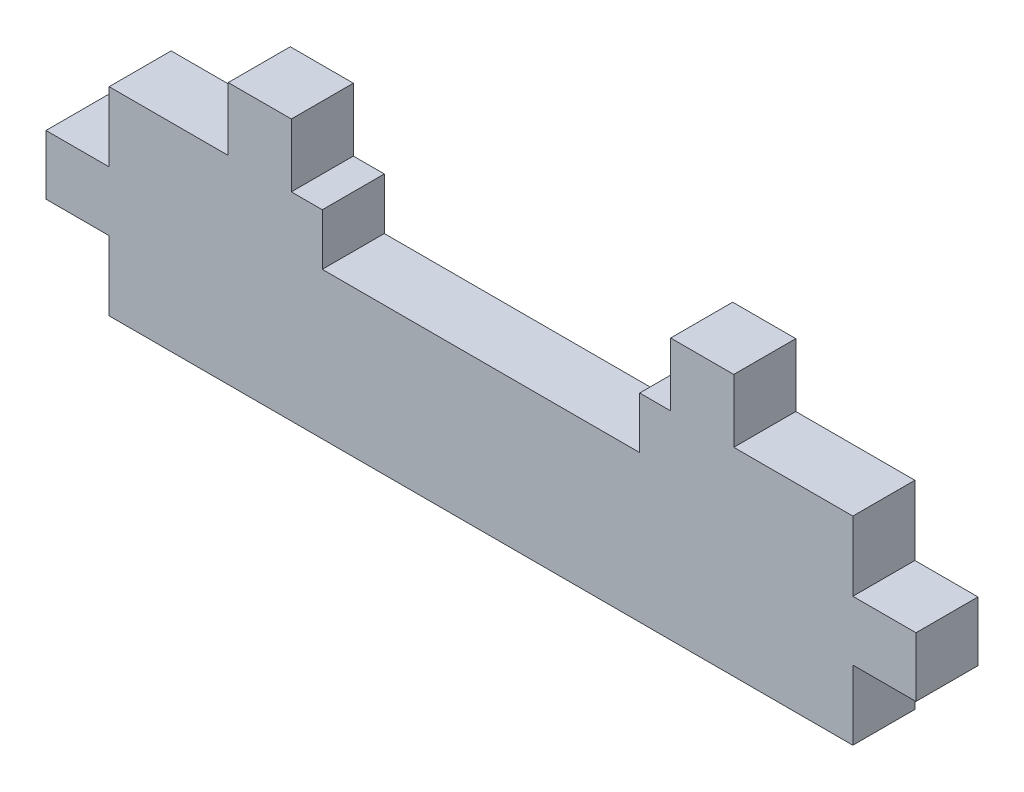
ISO-10303-21;
HEADER;
FILE_DESCRIPTION(('STEP AP214'),'2;1');
FILE_NAME('part.step','',(''),(''),'','','');
FILE_SCHEMA(('AUTOMOTIVE_DESIGN { 1 0 10303 214 1 1 1 1 }'));
ENDSEC;
DATA;
#1=APPLICATION_CONTEXT('core data for automotive mechanical design processes');
#2=APPLICATION_PROTOCOL_DEFINITION('international standard','automotive_design',2000,#1);
#3=PRODUCT_CONTEXT('',#1,'mechanical');
#4=PRODUCT('Part','Part','',(#3));
#5=PRODUCT_RELATED_PRODUCT_CATEGORY('part','',(#4));
#6=PRODUCT_DEFINITION_FORMATION('','',#4);
#7=PRODUCT_DEFINITION_CONTEXT('part definition',#1,'design');
#8=PRODUCT_DEFINITION('design','',#6,#7);
#9=PRODUCT_DEFINITION_SHAPE('','',#8);
#10=(LENGTH_UNIT() NAMED_UNIT(*) SI_UNIT(.MILLI.,.METRE.));
#11=(NAMED_UNIT(*) PLANE_ANGLE_UNIT() SI_UNIT($,.RADIAN.));
#12=(NAMED_UNIT(*) SI_UNIT($,.STERADIAN.) SOLID_ANGLE_UNIT());
#13=UNCERTAINTY_MEASURE_WITH_UNIT(LENGTH_MEASURE(1.E-05),#10,'distance_accuracy_value','');
#14=(GEOMETRIC_REPRESENTATION_CONTEXT(3) GLOBAL_UNCERTAINTY_ASSIGNED_CONTEXT((#13)) GLOBAL_UNIT_ASSIGNED_CONTEXT((#10,
#11,#12)) REPRESENTATION_CONTEXT('',''));
#15=CARTESIAN_POINT('',(0.,0.,0.));
#16=DIRECTION('',(0.,0.,1.));
#17=DIRECTION('',(1.,0.,0.));
#18=AXIS2_PLACEMENT_3D('',#15,#16,#17);
#19=CARTESIAN_POINT('',(0.,-6.59,3.125));
#20=DIRECTION('',(0.,1.,0.));
#21=DIRECTION('',(0.,0.,1.));
#22=AXIS2_PLACEMENT_3D('',#19,#20,#21);
#23=PLANE('',#22);
#24=DIRECTION('',(1.,0.,0.));
#25=VECTOR('',#24,1.);
#26=CARTESIAN_POINT('',(0.,-6.59,0.));
#27=LINE('',#26,#25);
#28=CARTESIAN_POINT('',(-18.735,-6.59,0.));
#29=VERTEX_POINT('',#28);
#30=CARTESIAN_POINT('',(18.735,-6.59,0.));
#31=VERTEX_POINT('',#30);
#32=EDGE_CURVE('E174',#29,#31,#27,.T.);
#33=ORIENTED_EDGE('',*,*,#32,.T.);
#34=DIRECTION('',(0.,0.,-1.));
#35=VECTOR('',#34,1.);
#36=CARTESIAN_POINT('',(18.735,-6.59,3.125));
#37=LINE('',#36,#35);
#38=CARTESIAN_POINT('',(18.735,-6.59,3.125));
#39=VERTEX_POINT('',#38);
#40=EDGE_CURVE('E11',#39,#31,#37,.T.);
#41=ORIENTED_EDGE('',*,*,#40,.F.);
#42=DIRECTION('',(1.,0.,0.));
#43=VECTOR('',#42,1.);
#44=CARTESIAN_POINT('',(0.,-6.59,3.125));
#45=LINE('',#44,#43);
#46=CARTESIAN_POINT('',(-18.735,-6.59,3.125));
#47=VERTEX_POINT('',#46);
#48=EDGE_CURVE('E114',#47,#39,#45,.T.);
#49=ORIENTED_EDGE('',*,*,#48,.F.);
#50=DIRECTION('',(0.,0.,-1.));
#51=VECTOR('',#50,1.);
#52=CARTESIAN_POINT('',(-18.735,-6.59,3.125));
#53=LINE('',#52,#51);
#54=EDGE_CURVE('E385',#47,#29,#53,.T.);
#55=ORIENTED_EDGE('',*,*,#54,.T.);
#56=EDGE_LOOP('',(#33,#41,#49,#55));
#57=FACE_BOUND('',#56,.T.);
#58=ADVANCED_FACE('F39',(#57),#23,.F.);
#59=CARTESIAN_POINT('',(18.735,-6.59,3.125));
#60=DIRECTION('',(-1.,0.,0.));
#61=DIRECTION('',(0.,-1.,0.));
#62=AXIS2_PLACEMENT_3D('',#59,#60,#61);
#63=PLANE('',#62);
#64=DIRECTION('',(0.,1.,0.));
#65=VECTOR('',#64,1.);
#66=CARTESIAN_POINT('',(18.735,-6.59,0.));
#67=LINE('',#66,#65);
#68=CARTESIAN_POINT('',(18.735,-3.09,0.));
#69=VERTEX_POINT('',#68);
#70=EDGE_CURVE('E177',#31,#69,#67,.T.);
#71=ORIENTED_EDGE('',*,*,#70,.T.);
#72=DIRECTION('',(0.,0.,-1.));
#73=VECTOR('',#72,1.);
#74=CARTESIAN_POINT('',(18.735,-3.09,3.125));
#75=LINE('',#74,#73);
#76=CARTESIAN_POINT('',(18.735,-3.09,3.125));
#77=VERTEX_POINT('',#76);
#78=EDGE_CURVE('E48',#77,#69,#75,.T.);
#79=ORIENTED_EDGE('',*,*,#78,.F.);
#80=DIRECTION('',(0.,1.,0.));
#81=VECTOR('',#80,1.);
#82=CARTESIAN_POINT('',(18.735,-6.59,3.125));
#83=LINE('',#82,#81);
#84=EDGE_CURVE('E435',#39,#77,#83,.T.);
#85=ORIENTED_EDGE('',*,*,#84,.F.);
#86=ORIENTED_EDGE('',*,*,#40,.T.);
#87=EDGE_LOOP('',(#71,#79,#85,#86));
#88=FACE_BOUND('',#87,.T.);
#89=ADVANCED_FACE('F438',(#88),#63,.F.);
#90=CARTESIAN_POINT('',(18.735,-3.09,3.125));
#91=DIRECTION('',(0.,1.,0.));
#92=DIRECTION('',(-1.,0.,0.));
#93=AXIS2_PLACEMENT_3D('',#90,#91,#92);
#94=PLANE('',#93);
#95=DIRECTION('',(1.,0.,0.));
#96=VECTOR('',#95,1.);
#97=CARTESIAN_POINT('',(18.735,-3.09,0.));
#98=LINE('',#97,#96);
#99=CARTESIAN_POINT('',(21.915,-3.09,0.));
#100=VERTEX_POINT('',#99);
#101=EDGE_CURVE('E181',#69,#100,#98,.T.);
#102=ORIENTED_EDGE('',*,*,#101,.T.);
#103=DIRECTION('',(0.,0.,-1.));
#104=VECTOR('',#103,1.);
#105=CARTESIAN_POINT('',(21.915,-3.09,3.125));
#106=LINE('',#105,#104);
#107=CARTESIAN_POINT('',(21.915,-3.09,3.125));
#108=VERTEX_POINT('',#107);
#109=EDGE_CURVE('E238',#108,#100,#106,.T.);
#110=ORIENTED_EDGE('',*,*,#109,.F.);
#111=DIRECTION('',(1.,0.,0.));
#112=VECTOR('',#111,1.);
#113=CARTESIAN_POINT('',(18.735,-3.09,3.125));
#114=LINE('',#113,#112);
#115=EDGE_CURVE('E249',#77,#108,#114,.T.);
#116=ORIENTED_EDGE('',*,*,#115,.F.);
#117=ORIENTED_EDGE('',*,*,#78,.T.);
#118=EDGE_LOOP('',(#102,#110,#116,#117));
#119=FACE_BOUND('',#118,.T.);
#120=ADVANCED_FACE('F247',(#119),#94,.F.);
#121=CARTESIAN_POINT('',(21.915,-3.09,3.125));
#122=DIRECTION('',(-1.,0.,0.));
#123=DIRECTION('',(0.,-1.,0.));
#124=AXIS2_PLACEMENT_3D('',#121,#122,#123);
#125=PLANE('',#124);
#126=DIRECTION('',(0.,1.,0.));
#127=VECTOR('',#126,1.);
#128=CARTESIAN_POINT('',(21.915,-3.09,0.));
#129=LINE('',#128,#127);
#130=CARTESIAN_POINT('',(21.915,-0.0899999999999968,0.));
#131=VERTEX_POINT('',#130);
#132=EDGE_CURVE('E184',#100,#131,#129,.T.);
#133=ORIENTED_EDGE('',*,*,#132,.T.);
#134=DIRECTION('',(0.,0.,-1.));
#135=VECTOR('',#134,1.);
#136=CARTESIAN_POINT('',(21.915,-0.0899999999999968,3.125));
#137=LINE('',#136,#135);
#138=CARTESIAN_POINT('',(21.915,-0.0899999999999968,3.125));
#139=VERTEX_POINT('',#138);
#140=EDGE_CURVE('E234',#139,#131,#137,.T.);
#141=ORIENTED_EDGE('',*,*,#140,.F.);
#142=DIRECTION('',(0.,1.,0.));
#143=VECTOR('',#142,1.);
#144=CARTESIAN_POINT('',(21.915,-3.09,3.125));
#145=LINE('',#144,#143);
#146=EDGE_CURVE('E270',#108,#139,#145,.T.);
#147=ORIENTED_EDGE('',*,*,#146,.F.);
#148=ORIENTED_EDGE('',*,*,#109,.T.);
#149=EDGE_LOOP('',(#133,#141,#147,#148));
#150=FACE_BOUND('',#149,.T.);
#151=ADVANCED_FACE('F260',(#150),#125,.F.);
#152=CARTESIAN_POINT('',(21.915,-0.0899999999999968,3.125));
#153=DIRECTION('',(0.,-1.,0.));
#154=DIRECTION('',(1.,0.,0.));
#155=AXIS2_PLACEMENT_3D('',#152,#153,#154);
#156=PLANE('',#155);
#157=DIRECTION('',(-1.,0.,0.));
#158=VECTOR('',#157,1.);
#159=CARTESIAN_POINT('',(21.915,-0.0899999999999968,0.));
#160=LINE('',#159,#158);
#161=CARTESIAN_POINT('',(18.735,-0.0899999999999971,0.));
#162=VERTEX_POINT('',#161);
#163=EDGE_CURVE('E187',#131,#162,#160,.T.);
#164=ORIENTED_EDGE('',*,*,#163,.T.);
#165=DIRECTION('',(0.,0.,-1.));
#166=VECTOR('',#165,1.);
#167=CARTESIAN_POINT('',(18.735,-0.0899999999999971,3.125));
#168=LINE('',#167,#166);
#169=CARTESIAN_POINT('',(18.735,-0.0899999999999971,3.125));
#170=VERTEX_POINT('',#169);
#171=EDGE_CURVE('E230',#170,#162,#168,.T.);
#172=ORIENTED_EDGE('',*,*,#171,.F.);
#173=DIRECTION('',(-1.,0.,0.));
#174=VECTOR('',#173,1.);
#175=CARTESIAN_POINT('',(21.915,-0.0899999999999968,3.125));
#176=LINE('',#175,#174);
#177=EDGE_CURVE('E266',#139,#170,#176,.T.);
#178=ORIENTED_EDGE('',*,*,#177,.F.);
#179=ORIENTED_EDGE('',*,*,#140,.T.);
#180=EDGE_LOOP('',(#164,#172,#178,#179));
#181=FACE_BOUND('',#180,.T.);
#182=ADVANCED_FACE('F264',(#181),#156,.F.);
#183=CARTESIAN_POINT('',(18.735,-0.0899999999999971,3.125));
#184=DIRECTION('',(-1.,0.,0.));
#185=DIRECTION('',(0.,0.,1.));
#186=AXIS2_PLACEMENT_3D('',#183,#184,#185);
#187=PLANE('',#186);
#188=DIRECTION('',(0.,1.,0.));
#189=VECTOR('',#188,1.);
#190=CARTESIAN_POINT('',(18.735,-0.0899999999999971,0.));
#191=LINE('',#190,#189);
#192=CARTESIAN_POINT('',(18.735,3.41,0.));
#193=VERTEX_POINT('',#192);
#194=EDGE_CURVE('E190',#162,#193,#191,.T.);
#195=ORIENTED_EDGE('',*,*,#194,.T.);
#196=DIRECTION('',(0.,0.,-1.));
#197=VECTOR('',#196,1.);
#198=CARTESIAN_POINT('',(18.735,3.41,3.125));
#199=LINE('',#198,#197);
#200=CARTESIAN_POINT('',(18.735,3.41,3.125));
#201=VERTEX_POINT('',#200);
#202=EDGE_CURVE('E226',#201,#193,#199,.T.);
#203=ORIENTED_EDGE('',*,*,#202,.F.);
#204=DIRECTION('',(0.,1.,0.));
#205=VECTOR('',#204,1.);
#206=CARTESIAN_POINT('',(18.735,-0.0899999999999971,3.125));
#207=LINE('',#206,#205);
#208=EDGE_CURVE('E269',#170,#201,#207,.T.);
#209=ORIENTED_EDGE('',*,*,#208,.F.);
#210=ORIENTED_EDGE('',*,*,#171,.T.);
#211=EDGE_LOOP('',(#195,#203,#209,#210));
#212=FACE_BOUND('',#211,.T.);
#213=ADVANCED_FACE('F545',(#212),#187,.F.);
#214=CARTESIAN_POINT('',(18.735,3.41,3.125));
#215=DIRECTION('',(0.,-1.,0.));
#216=DIRECTION('',(1.,0.,0.));
#217=AXIS2_PLACEMENT_3D('',#214,#215,#216);
#218=PLANE('',#217);
#219=DIRECTION('',(-1.,0.,0.));
#220=VECTOR('',#219,1.);
#221=CARTESIAN_POINT('',(18.735,3.41,0.));
#222=LINE('',#221,#220);
#223=CARTESIAN_POINT('',(12.735,3.41,0.));
#224=VERTEX_POINT('',#223);
#225=EDGE_CURVE('E193',#193,#224,#222,.T.);
#226=ORIENTED_EDGE('',*,*,#225,.T.);
#227=DIRECTION('',(0.,0.,-1.));
#228=VECTOR('',#227,1.);
#229=CARTESIAN_POINT('',(12.735,3.41,3.125));
#230=LINE('',#229,#228);
#231=CARTESIAN_POINT('',(12.735,3.41,3.125));
#232=VERTEX_POINT('',#231);
#233=EDGE_CURVE('E222',#232,#224,#230,.T.);
#234=ORIENTED_EDGE('',*,*,#233,.F.);
#235=DIRECTION('',(-1.,0.,0.));
#236=VECTOR('',#235,1.);
#237=CARTESIAN_POINT('',(18.735,3.41,3.125));
#238=LINE('',#237,#236);
#239=EDGE_CURVE('E274',#201,#232,#238,.T.);
#240=ORIENTED_EDGE('',*,*,#239,.F.);
#241=ORIENTED_EDGE('',*,*,#202,.T.);
#242=EDGE_LOOP('',(#226,#234,#240,#241));
#243=FACE_BOUND('',#242,.T.);
#244=ADVANCED_FACE('F548',(#243),#218,.F.);
#245=CARTESIAN_POINT('',(12.735,3.41,3.125));
#246=DIRECTION('',(-1.,0.,0.));
#247=DIRECTION('',(0.,0.,1.));
#248=AXIS2_PLACEMENT_3D('',#245,#246,#247);
#249=PLANE('',#248);
#250=DIRECTION('',(0.,1.,0.));
#251=VECTOR('',#250,1.);
#252=CARTESIAN_POINT('',(12.735,3.41,0.));
#253=LINE('',#252,#251);
#254=CARTESIAN_POINT('',(12.735,6.59,0.));
#255=VERTEX_POINT('',#254);
#256=EDGE_CURVE('E196',#224,#255,#253,.T.);
#257=ORIENTED_EDGE('',*,*,#256,.T.);
#258=DIRECTION('',(0.,0.,-1.));
#259=VECTOR('',#258,1.);
#260=CARTESIAN_POINT('',(12.735,6.59,3.125));
#261=LINE('',#260,#259);
#262=CARTESIAN_POINT('',(12.735,6.59,3.125));
#263=VERTEX_POINT('',#262);
#264=EDGE_CURVE('E218',#263,#255,#261,.T.);
#265=ORIENTED_EDGE('',*,*,#264,.F.);
#266=DIRECTION('',(0.,1.,0.));
#267=VECTOR('',#266,1.);
#268=CARTESIAN_POINT('',(12.735,3.41,3.125));
#269=LINE('',#268,#267);
#270=EDGE_CURVE('E281',#232,#263,#269,.T.);
#271=ORIENTED_EDGE('',*,*,#270,.F.);
#272=ORIENTED_EDGE('',*,*,#233,.T.);
#273=EDGE_LOOP('',(#257,#265,#271,#272));
#274=FACE_BOUND('',#273,.T.);
#275=ADVANCED_FACE('F289',(#274),#249,.F.);
#276=CARTESIAN_POINT('',(12.735,6.59,3.125));
#277=DIRECTION('',(0.,-1.,0.));
#278=DIRECTION('',(0.,0.,-1.));
#279=AXIS2_PLACEMENT_3D('',#276,#277,#278);
#280=PLANE('',#279);
#281=DIRECTION('',(-1.,0.,0.));
#282=VECTOR('',#281,1.);
#283=CARTESIAN_POINT('',(12.735,6.59,0.));
#284=LINE('',#283,#282);
#285=CARTESIAN_POINT('',(9.55499999999999,6.59,0.));
#286=VERTEX_POINT('',#285);
#287=EDGE_CURVE('E199',#255,#286,#284,.T.);
#288=ORIENTED_EDGE('',*,*,#287,.T.);
#289=DIRECTION('',(0.,0.,-1.));
#290=VECTOR('',#289,1.);
#291=CARTESIAN_POINT('',(9.55499999999999,6.59,3.125));
#292=LINE('',#291,#290);
#293=CARTESIAN_POINT('',(9.55499999999999,6.59,3.125));
#294=VERTEX_POINT('',#293);
#295=EDGE_CURVE('E160',#294,#286,#292,.T.);
#296=ORIENTED_EDGE('',*,*,#295,.F.);
#297=DIRECTION('',(-1.,0.,0.));
#298=VECTOR('',#297,1.);
#299=CARTESIAN_POINT('',(12.735,6.59,3.125));
#300=LINE('',#299,#298);
#301=EDGE_CURVE('E149',#263,#294,#300,.T.);
#302=ORIENTED_EDGE('',*,*,#301,.F.);
#303=ORIENTED_EDGE('',*,*,#264,.T.);
#304=EDGE_LOOP('',(#288,#296,#302,#303));
#305=FACE_BOUND('',#304,.T.);
#306=ADVANCED_FACE('F293',(#305),#280,.F.);
#307=CARTESIAN_POINT('',(9.55499999999999,6.59,3.125));
#308=DIRECTION('',(1.,0.,0.));
#309=DIRECTION('',(0.,1.,0.));
#310=AXIS2_PLACEMENT_3D('',#307,#308,#309);
#311=PLANE('',#310);
#312=DIRECTION('',(0.,-1.,0.));
#313=VECTOR('',#312,1.);
#314=CARTESIAN_POINT('',(9.55499999999999,6.59,0.));
#315=LINE('',#314,#313);
#316=CARTESIAN_POINT('',(9.555,3.41,0.));
#317=VERTEX_POINT('',#316);
#318=EDGE_CURVE('E158',#286,#317,#315,.T.);
#319=ORIENTED_EDGE('',*,*,#318,.T.);
#320=DIRECTION('',(0.,0.,-1.));
#321=VECTOR('',#320,1.);
#322=CARTESIAN_POINT('',(9.555,3.41,3.125));
#323=LINE('',#322,#321);
#324=CARTESIAN_POINT('',(9.555,3.41,3.125));
#325=VERTEX_POINT('',#324);
#326=EDGE_CURVE('E155',#325,#317,#323,.T.);
#327=ORIENTED_EDGE('',*,*,#326,.F.);
#328=DIRECTION('',(0.,-1.,0.));
#329=VECTOR('',#328,1.);
#330=CARTESIAN_POINT('',(9.55499999999999,6.59,3.125));
#331=LINE('',#330,#329);
#332=EDGE_CURVE('E143',#294,#325,#331,.T.);
#333=ORIENTED_EDGE('',*,*,#332,.F.);
#334=ORIENTED_EDGE('',*,*,#295,.T.);
#335=EDGE_LOOP('',(#319,#327,#333,#334));
#336=FACE_BOUND('',#335,.T.);
#337=ADVANCED_FACE('F156',(#336),#311,.F.);
#338=CARTESIAN_POINT('',(9.555,3.41,3.125));
#339=DIRECTION('',(0.,-1.,0.));
#340=DIRECTION('',(1.,0.,0.));
#341=AXIS2_PLACEMENT_3D('',#338,#339,#340);
#342=PLANE('',#341);
#343=DIRECTION('',(-1.,0.,0.));
#344=VECTOR('',#343,1.);
#345=CARTESIAN_POINT('',(9.555,3.41,0.));
#346=LINE('',#345,#344);
#347=CARTESIAN_POINT('',(7.99499999999999,3.41,0.));
#348=VERTEX_POINT('',#347);
#349=EDGE_CURVE('E98',#317,#348,#346,.T.);
#350=ORIENTED_EDGE('',*,*,#349,.T.);
#351=DIRECTION('',(0.,0.,-1.));
#352=VECTOR('',#351,1.);
#353=CARTESIAN_POINT('',(7.99499999999999,3.41,3.125));
#354=LINE('',#353,#352);
#355=CARTESIAN_POINT('',(7.99499999999999,3.41,3.125));
#356=VERTEX_POINT('',#355);
#357=EDGE_CURVE('E161',#356,#348,#354,.T.);
#358=ORIENTED_EDGE('',*,*,#357,.F.);
#359=DIRECTION('',(-1.,0.,0.));
#360=VECTOR('',#359,1.);
#361=CARTESIAN_POINT('',(9.555,3.41,3.125));
#362=LINE('',#361,#360);
#363=EDGE_CURVE('E147',#325,#356,#362,.T.);
#364=ORIENTED_EDGE('',*,*,#363,.F.);
#365=ORIENTED_EDGE('',*,*,#326,.T.);
#366=EDGE_LOOP('',(#350,#358,#364,#365));
#367=FACE_BOUND('',#366,.T.);
#368=ADVANCED_FACE('F163',(#367),#342,.F.);
#369=CARTESIAN_POINT('',(7.99499999999999,3.41,3.125));
#370=DIRECTION('',(1.,0.,0.));
#371=DIRECTION('',(0.,1.,0.));
#372=AXIS2_PLACEMENT_3D('',#369,#370,#371);
#373=PLANE('',#372);
#374=DIRECTION('',(0.,-1.,0.));
#375=VECTOR('',#374,1.);
#376=CARTESIAN_POINT('',(7.99499999999999,3.41,0.));
#377=LINE('',#376,#375);
#378=CARTESIAN_POINT('',(7.995,0.81,0.));
#379=VERTEX_POINT('',#378);
#380=EDGE_CURVE('E206',#348,#379,#377,.T.);
#381=ORIENTED_EDGE('',*,*,#380,.T.);
#382=DIRECTION('',(0.,0.,-1.));
#383=VECTOR('',#382,1.);
#384=CARTESIAN_POINT('',(7.995,0.81,3.125));
#385=LINE('',#384,#383);
#386=CARTESIAN_POINT('',(7.995,0.81,3.125));
#387=VERTEX_POINT('',#386);
#388=EDGE_CURVE('E173',#387,#379,#385,.T.);
#389=ORIENTED_EDGE('',*,*,#388,.F.);
#390=DIRECTION('',(0.,-1.,0.));
#391=VECTOR('',#390,1.);
#392=CARTESIAN_POINT('',(7.99499999999999,3.41,3.125));
#393=LINE('',#392,#391);
#394=EDGE_CURVE('E56',#356,#387,#393,.T.);
#395=ORIENTED_EDGE('',*,*,#394,.F.);
#396=ORIENTED_EDGE('',*,*,#357,.T.);
#397=EDGE_LOOP('',(#381,#389,#395,#396));
#398=FACE_BOUND('',#397,.T.);
#399=ADVANCED_FACE('F295',(#398),#373,.F.);
#400=CARTESIAN_POINT('',(0.569270121059102,0.809999999999999,3.125));
#401=DIRECTION('',(0.,-1.,0.));
#402=DIRECTION('',(1.,0.,0.));
#403=AXIS2_PLACEMENT_3D('',#400,#401,#402);
#404=PLANE('',#403);
#405=DIRECTION('',(-1.,0.,0.));
#406=VECTOR('',#405,1.);
#407=CARTESIAN_POINT('',(0.569270121059102,0.809999999999999,0.));
#408=LINE('',#407,#406);
#409=CARTESIAN_POINT('',(-7.995,0.81,0.));
#410=VERTEX_POINT('',#409);
#411=EDGE_CURVE('E106',#379,#410,#408,.T.);
#412=ORIENTED_EDGE('',*,*,#411,.T.);
#413=DIRECTION('',(0.,0.,-1.));
#414=VECTOR('',#413,1.);
#415=CARTESIAN_POINT('',(-7.995,0.81,3.125));
#416=LINE('',#415,#414);
#417=CARTESIAN_POINT('',(-7.995,0.81,3.125));
#418=VERTEX_POINT('',#417);
#419=EDGE_CURVE('E178',#418,#410,#416,.T.);
#420=ORIENTED_EDGE('',*,*,#419,.F.);
#421=DIRECTION('',(-1.,0.,0.));
#422=VECTOR('',#421,1.);
#423=CARTESIAN_POINT('',(7.995,0.81,3.125));
#424=LINE('',#423,#422);
#425=EDGE_CURVE('E167',#387,#418,#424,.T.);
#426=ORIENTED_EDGE('',*,*,#425,.F.);
#427=ORIENTED_EDGE('',*,*,#388,.T.);
#428=EDGE_LOOP('',(#412,#420,#426,#427));
#429=FACE_BOUND('',#428,.T.);
#430=ADVANCED_FACE('F298',(#429),#404,.F.);
#431=CARTESIAN_POINT('',(0.,0.,3.125));
#432=DIRECTION('',(0.,0.,1.));
#433=DIRECTION('',(1.,0.,0.));
#434=AXIS2_PLACEMENT_3D('',#431,#432,#433);
#435=PLANE('',#434);
#436=ORIENTED_EDGE('',*,*,#425,.T.);
#437=DIRECTION('',(0.,-1.,0.));
#438=VECTOR('',#437,1.);
#439=CARTESIAN_POINT('',(-7.99499999999999,3.41,3.125));
#440=LINE('',#439,#438);
#441=CARTESIAN_POINT('',(-7.99499999999999,3.41,3.125));
#442=VERTEX_POINT('',#441);
#443=EDGE_CURVE('E307',#442,#418,#440,.T.);
#444=ORIENTED_EDGE('',*,*,#443,.F.);
#445=DIRECTION('',(1.,0.,0.));
#446=VECTOR('',#445,1.);
#447=CARTESIAN_POINT('',(-9.555,3.41,3.125));
#448=LINE('',#447,#446);
#449=CARTESIAN_POINT('',(-9.555,3.41,3.125));
#450=VERTEX_POINT('',#449);
#451=EDGE_CURVE('E399',#450,#442,#448,.T.);
#452=ORIENTED_EDGE('',*,*,#451,.F.);
#453=DIRECTION('',(0.,-1.,0.));
#454=VECTOR('',#453,1.);
#455=CARTESIAN_POINT('',(-9.55499999999999,6.59,3.125));
#456=LINE('',#455,#454);
#457=CARTESIAN_POINT('',(-9.55499999999999,6.59,3.125));
#458=VERTEX_POINT('',#457);
#459=EDGE_CURVE('E517',#458,#450,#456,.T.);
#460=ORIENTED_EDGE('',*,*,#459,.F.);
#461=DIRECTION('',(1.,0.,0.));
#462=VECTOR('',#461,1.);
#463=CARTESIAN_POINT('',(-12.735,6.59,3.125));
#464=LINE('',#463,#462);
#465=CARTESIAN_POINT('',(-12.735,6.59,3.125));
#466=VERTEX_POINT('',#465);
#467=EDGE_CURVE('E756',#466,#458,#464,.T.);
#468=ORIENTED_EDGE('',*,*,#467,.F.);
#469=DIRECTION('',(0.,1.,0.));
#470=VECTOR('',#469,1.);
#471=CARTESIAN_POINT('',(-12.735,3.41,3.125));
#472=LINE('',#471,#470);
#473=CARTESIAN_POINT('',(-12.735,3.41,3.125));
#474=VERTEX_POINT('',#473);
#475=EDGE_CURVE('E506',#474,#466,#472,.T.);
#476=ORIENTED_EDGE('',*,*,#475,.F.);
#477=DIRECTION('',(1.,0.,0.));
#478=VECTOR('',#477,1.);
#479=CARTESIAN_POINT('',(-18.735,3.41,3.125));
#480=LINE('',#479,#478);
#481=CARTESIAN_POINT('',(-18.735,3.41,3.125));
#482=VERTEX_POINT('',#481);
#483=EDGE_CURVE('E500',#482,#474,#480,.T.);
#484=ORIENTED_EDGE('',*,*,#483,.F.);
#485=DIRECTION('',(0.,1.,0.));
#486=VECTOR('',#485,1.);
#487=CARTESIAN_POINT('',(-18.735,-0.0899999999999971,3.125));
#488=LINE('',#487,#486);
#489=CARTESIAN_POINT('',(-18.735,-0.0899999999999971,3.125));
#490=VERTEX_POINT('',#489);
#491=EDGE_CURVE('E765',#490,#482,#488,.T.);
#492=ORIENTED_EDGE('',*,*,#491,.F.);
#493=DIRECTION('',(1.,0.,0.));
#494=VECTOR('',#493,1.);
#495=CARTESIAN_POINT('',(-21.915,-0.0899999999999968,3.125));
#496=LINE('',#495,#494);
#497=CARTESIAN_POINT('',(-21.915,-0.0899999999999968,3.125));
#498=VERTEX_POINT('',#497);
#499=EDGE_CURVE('E489',#498,#490,#496,.T.);
#500=ORIENTED_EDGE('',*,*,#499,.F.);
#501=DIRECTION('',(0.,1.,0.));
#502=VECTOR('',#501,1.);
#503=CARTESIAN_POINT('',(-21.915,-3.09,3.125));
#504=LINE('',#503,#502);
#505=CARTESIAN_POINT('',(-21.915,-3.09,3.125));
#506=VERTEX_POINT('',#505);
#507=EDGE_CURVE('E445',#506,#498,#504,.T.);
#508=ORIENTED_EDGE('',*,*,#507,.F.);
#509=DIRECTION('',(-1.,0.,0.));
#510=VECTOR('',#509,1.);
#511=CARTESIAN_POINT('',(-18.735,-3.09,3.125));
#512=LINE('',#511,#510);
#513=CARTESIAN_POINT('',(-18.735,-3.09,3.125));
#514=VERTEX_POINT('',#513);
#515=EDGE_CURVE('E441',#514,#506,#512,.T.);
#516=ORIENTED_EDGE('',*,*,#515,.F.);
#517=DIRECTION('',(0.,1.,0.));
#518=VECTOR('',#517,1.);
#519=CARTESIAN_POINT('',(-18.735,-6.59,3.125));
#520=LINE('',#519,#518);
#521=EDGE_CURVE('E379',#47,#514,#520,.T.);
#522=ORIENTED_EDGE('',*,*,#521,.F.);
#523=ORIENTED_EDGE('',*,*,#48,.T.);
#524=ORIENTED_EDGE('',*,*,#84,.T.);
#525=ORIENTED_EDGE('',*,*,#115,.T.);
#526=ORIENTED_EDGE('',*,*,#146,.T.);
#527=ORIENTED_EDGE('',*,*,#177,.T.);
#528=ORIENTED_EDGE('',*,*,#208,.T.);
#529=ORIENTED_EDGE('',*,*,#239,.T.);
#530=ORIENTED_EDGE('',*,*,#270,.T.);
#531=ORIENTED_EDGE('',*,*,#301,.T.);
#532=ORIENTED_EDGE('',*,*,#332,.T.);
#533=ORIENTED_EDGE('',*,*,#363,.T.);
#534=ORIENTED_EDGE('',*,*,#394,.T.);
#535=EDGE_LOOP('',(#436,#444,#452,#460,#468,#476,#484,#492,#500,#508,#516,#522,#523,#524,#525,
#526,#527,#528,#529,#530,#531,#532,#533,#534));
#536=FACE_BOUND('',#535,.T.);
#537=ADVANCED_FACE('F145',(#536),#435,.T.);
#538=CARTESIAN_POINT('',(0.,0.,0.));
#539=DIRECTION('',(0.,0.,1.));
#540=DIRECTION('',(1.,0.,0.));
#541=AXIS2_PLACEMENT_3D('',#538,#539,#540);
#542=PLANE('',#541);
#543=ORIENTED_EDGE('',*,*,#32,.F.);
#544=DIRECTION('',(0.,1.,0.));
#545=VECTOR('',#544,1.);
#546=CARTESIAN_POINT('',(-18.735,-6.59,0.));
#547=LINE('',#546,#545);
#548=CARTESIAN_POINT('',(-18.735,-3.09,0.));
#549=VERTEX_POINT('',#548);
#550=EDGE_CURVE('E378',#29,#549,#547,.T.);
#551=ORIENTED_EDGE('',*,*,#550,.T.);
#552=DIRECTION('',(-1.,0.,0.));
#553=VECTOR('',#552,1.);
#554=CARTESIAN_POINT('',(-18.735,-3.09,0.));
#555=LINE('',#554,#553);
#556=CARTESIAN_POINT('',(-21.915,-3.09,0.));
#557=VERTEX_POINT('',#556);
#558=EDGE_CURVE('E388',#549,#557,#555,.T.);
#559=ORIENTED_EDGE('',*,*,#558,.T.);
#560=DIRECTION('',(0.,1.,0.));
#561=VECTOR('',#560,1.);
#562=CARTESIAN_POINT('',(-21.915,-3.09,0.));
#563=LINE('',#562,#561);
#564=CARTESIAN_POINT('',(-21.915,-0.0899999999999968,0.));
#565=VERTEX_POINT('',#564);
#566=EDGE_CURVE('E393',#557,#565,#563,.T.);
#567=ORIENTED_EDGE('',*,*,#566,.T.);
#568=DIRECTION('',(1.,0.,0.));
#569=VECTOR('',#568,1.);
#570=CARTESIAN_POINT('',(-21.915,-0.0899999999999968,0.));
#571=LINE('',#570,#569);
#572=CARTESIAN_POINT('',(-18.735,-0.0899999999999971,0.));
#573=VERTEX_POINT('',#572);
#574=EDGE_CURVE('E476',#565,#573,#571,.T.);
#575=ORIENTED_EDGE('',*,*,#574,.T.);
#576=DIRECTION('',(0.,1.,0.));
#577=VECTOR('',#576,1.);
#578=CARTESIAN_POINT('',(-18.735,-0.0899999999999971,0.));
#579=LINE('',#578,#577);
#580=CARTESIAN_POINT('',(-18.735,3.41,0.));
#581=VERTEX_POINT('',#580);
#582=EDGE_CURVE('E472',#573,#581,#579,.T.);
#583=ORIENTED_EDGE('',*,*,#582,.T.);
#584=DIRECTION('',(1.,0.,0.));
#585=VECTOR('',#584,1.);
#586=CARTESIAN_POINT('',(-18.735,3.41,0.));
#587=LINE('',#586,#585);
#588=CARTESIAN_POINT('',(-12.735,3.41,0.));
#589=VERTEX_POINT('',#588);
#590=EDGE_CURVE('E468',#581,#589,#587,.T.);
#591=ORIENTED_EDGE('',*,*,#590,.T.);
#592=DIRECTION('',(0.,1.,0.));
#593=VECTOR('',#592,1.);
#594=CARTESIAN_POINT('',(-12.735,3.41,0.));
#595=LINE('',#594,#593);
#596=CARTESIAN_POINT('',(-12.735,6.59,0.));
#597=VERTEX_POINT('',#596);
#598=EDGE_CURVE('E464',#589,#597,#595,.T.);
#599=ORIENTED_EDGE('',*,*,#598,.T.);
#600=DIRECTION('',(1.,0.,0.));
#601=VECTOR('',#600,1.);
#602=CARTESIAN_POINT('',(-12.735,6.59,0.));
#603=LINE('',#602,#601);
#604=CARTESIAN_POINT('',(-9.55499999999999,6.59,0.));
#605=VERTEX_POINT('',#604);
#606=EDGE_CURVE('E460',#597,#605,#603,.T.);
#607=ORIENTED_EDGE('',*,*,#606,.T.);
#608=DIRECTION('',(0.,-1.,0.));
#609=VECTOR('',#608,1.);
#610=CARTESIAN_POINT('',(-9.55499999999999,6.59,0.));
#611=LINE('',#610,#609);
#612=CARTESIAN_POINT('',(-9.555,3.41,0.));
#613=VERTEX_POINT('',#612);
#614=EDGE_CURVE('E456',#605,#613,#611,.T.);
#615=ORIENTED_EDGE('',*,*,#614,.T.);
#616=DIRECTION('',(1.,0.,0.));
#617=VECTOR('',#616,1.);
#618=CARTESIAN_POINT('',(-9.555,3.41,0.));
#619=LINE('',#618,#617);
#620=CARTESIAN_POINT('',(-7.99499999999999,3.41,0.));
#621=VERTEX_POINT('',#620);
#622=EDGE_CURVE('E452',#613,#621,#619,.T.);
#623=ORIENTED_EDGE('',*,*,#622,.T.);
#624=DIRECTION('',(0.,-1.,0.));
#625=VECTOR('',#624,1.);
#626=CARTESIAN_POINT('',(-7.99499999999999,3.41,0.));
#627=LINE('',#626,#625);
#628=EDGE_CURVE('E449',#621,#410,#627,.T.);
#629=ORIENTED_EDGE('',*,*,#628,.T.);
#630=ORIENTED_EDGE('',*,*,#411,.F.);
#631=ORIENTED_EDGE('',*,*,#380,.F.);
#632=ORIENTED_EDGE('',*,*,#349,.F.);
#633=ORIENTED_EDGE('',*,*,#318,.F.);
#634=ORIENTED_EDGE('',*,*,#287,.F.);
#635=ORIENTED_EDGE('',*,*,#256,.F.);
#636=ORIENTED_EDGE('',*,*,#225,.F.);
#637=ORIENTED_EDGE('',*,*,#194,.F.);
#638=ORIENTED_EDGE('',*,*,#163,.F.);
#639=ORIENTED_EDGE('',*,*,#132,.F.);
#640=ORIENTED_EDGE('',*,*,#101,.F.);
#641=ORIENTED_EDGE('',*,*,#70,.F.);
#642=EDGE_LOOP('',(#543,#551,#559,#567,#575,#583,#591,#599,#607,#615,#623,#629,#630,#631,#632,
#633,#634,#635,#636,#637,#638,#639,#640,#641));
#643=FACE_BOUND('',#642,.T.);
#644=ADVANCED_FACE('F255',(#643),#542,.F.);
#645=CARTESIAN_POINT('',(-7.99499999999999,3.41,3.125));
#646=DIRECTION('',(1.,0.,0.));
#647=DIRECTION('',(0.,1.,0.));
#648=AXIS2_PLACEMENT_3D('',#645,#646,#647);
#649=PLANE('',#648);
#650=ORIENTED_EDGE('',*,*,#628,.F.);
#651=DIRECTION('',(0.,0.,-1.));
#652=VECTOR('',#651,1.);
#653=CARTESIAN_POINT('',(-7.99499999999999,3.41,3.125));
#654=LINE('',#653,#652);
#655=EDGE_CURVE('E428',#442,#621,#654,.T.);
#656=ORIENTED_EDGE('',*,*,#655,.F.);
#657=ORIENTED_EDGE('',*,*,#443,.T.);
#658=ORIENTED_EDGE('',*,*,#419,.T.);
#659=EDGE_LOOP('',(#650,#656,#657,#658));
#660=FACE_BOUND('',#659,.T.);
#661=ADVANCED_FACE('F522',(#660),#649,.T.);
#662=CARTESIAN_POINT('',(-9.555,3.41,3.125));
#663=DIRECTION('',(0.,1.,0.));
#664=DIRECTION('',(-1.,0.,0.));
#665=AXIS2_PLACEMENT_3D('',#662,#663,#664);
#666=PLANE('',#665);
#667=ORIENTED_EDGE('',*,*,#622,.F.);
#668=DIRECTION('',(0.,0.,-1.));
#669=VECTOR('',#668,1.);
#670=CARTESIAN_POINT('',(-9.555,3.41,3.125));
#671=LINE('',#670,#669);
#672=EDGE_CURVE('E425',#450,#613,#671,.T.);
#673=ORIENTED_EDGE('',*,*,#672,.F.);
#674=ORIENTED_EDGE('',*,*,#451,.T.);
#675=ORIENTED_EDGE('',*,*,#655,.T.);
#676=EDGE_LOOP('',(#667,#673,#674,#675));
#677=FACE_BOUND('',#676,.T.);
#678=ADVANCED_FACE('F519',(#677),#666,.T.);
#679=CARTESIAN_POINT('',(-9.55499999999999,6.59,3.125));
#680=DIRECTION('',(1.,0.,0.));
#681=DIRECTION('',(0.,1.,0.));
#682=AXIS2_PLACEMENT_3D('',#679,#680,#681);
#683=PLANE('',#682);
#684=ORIENTED_EDGE('',*,*,#614,.F.);
#685=DIRECTION('',(0.,0.,-1.));
#686=VECTOR('',#685,1.);
#687=CARTESIAN_POINT('',(-9.55499999999999,6.59,3.125));
#688=LINE('',#687,#686);
#689=EDGE_CURVE('E422',#458,#605,#688,.T.);
#690=ORIENTED_EDGE('',*,*,#689,.F.);
#691=ORIENTED_EDGE('',*,*,#459,.T.);
#692=ORIENTED_EDGE('',*,*,#672,.T.);
#693=EDGE_LOOP('',(#684,#690,#691,#692));
#694=FACE_BOUND('',#693,.T.);
#695=ADVANCED_FACE('F514',(#694),#683,.T.);
#696=CARTESIAN_POINT('',(-12.735,6.59,3.125));
#697=DIRECTION('',(0.,1.,0.));
#698=DIRECTION('',(0.,0.,1.));
#699=AXIS2_PLACEMENT_3D('',#696,#697,#698);
#700=PLANE('',#699);
#701=ORIENTED_EDGE('',*,*,#606,.F.);
#702=DIRECTION('',(0.,0.,-1.));
#703=VECTOR('',#702,1.);
#704=CARTESIAN_POINT('',(-12.735,6.59,3.125));
#705=LINE('',#704,#703);
#706=EDGE_CURVE('E419',#466,#597,#705,.T.);
#707=ORIENTED_EDGE('',*,*,#706,.F.);
#708=ORIENTED_EDGE('',*,*,#467,.T.);
#709=ORIENTED_EDGE('',*,*,#689,.T.);
#710=EDGE_LOOP('',(#701,#707,#708,#709));
#711=FACE_BOUND('',#710,.T.);
#712=ADVANCED_FACE('F510',(#711),#700,.T.);
#713=CARTESIAN_POINT('',(-12.735,3.41,3.125));
#714=DIRECTION('',(-1.,0.,0.));
#715=DIRECTION('',(0.,0.,1.));
#716=AXIS2_PLACEMENT_3D('',#713,#714,#715);
#717=PLANE('',#716);
#718=ORIENTED_EDGE('',*,*,#598,.F.);
#719=DIRECTION('',(0.,0.,-1.));
#720=VECTOR('',#719,1.);
#721=CARTESIAN_POINT('',(-12.735,3.41,3.125));
#722=LINE('',#721,#720);
#723=EDGE_CURVE('E416',#474,#589,#722,.T.);
#724=ORIENTED_EDGE('',*,*,#723,.F.);
#725=ORIENTED_EDGE('',*,*,#475,.T.);
#726=ORIENTED_EDGE('',*,*,#706,.T.);
#727=EDGE_LOOP('',(#718,#724,#725,#726));
#728=FACE_BOUND('',#727,.T.);
#729=ADVANCED_FACE('F504',(#728),#717,.T.);
#730=CARTESIAN_POINT('',(-18.735,3.41,3.125));
#731=DIRECTION('',(0.,1.,0.));
#732=DIRECTION('',(-1.,0.,0.));
#733=AXIS2_PLACEMENT_3D('',#730,#731,#732);
#734=PLANE('',#733);
#735=ORIENTED_EDGE('',*,*,#590,.F.);
#736=DIRECTION('',(0.,0.,-1.));
#737=VECTOR('',#736,1.);
#738=CARTESIAN_POINT('',(-18.735,3.41,3.125));
#739=LINE('',#738,#737);
#740=EDGE_CURVE('E413',#482,#581,#739,.T.);
#741=ORIENTED_EDGE('',*,*,#740,.F.);
#742=ORIENTED_EDGE('',*,*,#483,.T.);
#743=ORIENTED_EDGE('',*,*,#723,.T.);
#744=EDGE_LOOP('',(#735,#741,#742,#743));
#745=FACE_BOUND('',#744,.T.);
#746=ADVANCED_FACE('F497',(#745),#734,.T.);
#747=CARTESIAN_POINT('',(-18.735,-0.0899999999999971,3.125));
#748=DIRECTION('',(-1.,0.,0.));
#749=DIRECTION('',(0.,0.,1.));
#750=AXIS2_PLACEMENT_3D('',#747,#748,#749);
#751=PLANE('',#750);
#752=ORIENTED_EDGE('',*,*,#582,.F.);
#753=DIRECTION('',(0.,0.,-1.));
#754=VECTOR('',#753,1.);
#755=CARTESIAN_POINT('',(-18.735,-0.0899999999999971,3.125));
#756=LINE('',#755,#754);
#757=EDGE_CURVE('E410',#490,#573,#756,.T.);
#758=ORIENTED_EDGE('',*,*,#757,.F.);
#759=ORIENTED_EDGE('',*,*,#491,.T.);
#760=ORIENTED_EDGE('',*,*,#740,.T.);
#761=EDGE_LOOP('',(#752,#758,#759,#760));
#762=FACE_BOUND('',#761,.T.);
#763=ADVANCED_FACE('F493',(#762),#751,.T.);
#764=CARTESIAN_POINT('',(-21.915,-0.0899999999999968,3.125));
#765=DIRECTION('',(0.,1.,0.));
#766=DIRECTION('',(-1.,0.,0.));
#767=AXIS2_PLACEMENT_3D('',#764,#765,#766);
#768=PLANE('',#767);
#769=ORIENTED_EDGE('',*,*,#574,.F.);
#770=DIRECTION('',(0.,0.,-1.));
#771=VECTOR('',#770,1.);
#772=CARTESIAN_POINT('',(-21.915,-0.0899999999999968,3.125));
#773=LINE('',#772,#771);
#774=EDGE_CURVE('E407',#498,#565,#773,.T.);
#775=ORIENTED_EDGE('',*,*,#774,.F.);
#776=ORIENTED_EDGE('',*,*,#499,.T.);
#777=ORIENTED_EDGE('',*,*,#757,.T.);
#778=EDGE_LOOP('',(#769,#775,#776,#777));
#779=FACE_BOUND('',#778,.T.);
#780=ADVANCED_FACE('F487',(#779),#768,.T.);
#781=CARTESIAN_POINT('',(-21.915,-3.09,3.125));
#782=DIRECTION('',(-1.,0.,0.));
#783=DIRECTION('',(0.,-1.,0.));
#784=AXIS2_PLACEMENT_3D('',#781,#782,#783);
#785=PLANE('',#784);
#786=ORIENTED_EDGE('',*,*,#566,.F.);
#787=DIRECTION('',(0.,0.,-1.));
#788=VECTOR('',#787,1.);
#789=CARTESIAN_POINT('',(-21.915,-3.09,3.125));
#790=LINE('',#789,#788);
#791=EDGE_CURVE('E384',#506,#557,#790,.T.);
#792=ORIENTED_EDGE('',*,*,#791,.F.);
#793=ORIENTED_EDGE('',*,*,#507,.T.);
#794=ORIENTED_EDGE('',*,*,#774,.T.);
#795=EDGE_LOOP('',(#786,#792,#793,#794));
#796=FACE_BOUND('',#795,.T.);
#797=ADVANCED_FACE('F482',(#796),#785,.T.);
#798=CARTESIAN_POINT('',(-18.735,-3.09,3.125));
#799=DIRECTION('',(0.,-1.,0.));
#800=DIRECTION('',(1.,0.,0.));
#801=AXIS2_PLACEMENT_3D('',#798,#799,#800);
#802=PLANE('',#801);
#803=ORIENTED_EDGE('',*,*,#558,.F.);
#804=DIRECTION('',(0.,0.,-1.));
#805=VECTOR('',#804,1.);
#806=CARTESIAN_POINT('',(-18.735,-3.09,3.125));
#807=LINE('',#806,#805);
#808=EDGE_CURVE('E373',#514,#549,#807,.T.);
#809=ORIENTED_EDGE('',*,*,#808,.F.);
#810=ORIENTED_EDGE('',*,*,#515,.T.);
#811=ORIENTED_EDGE('',*,*,#791,.T.);
#812=EDGE_LOOP('',(#803,#809,#810,#811));
#813=FACE_BOUND('',#812,.T.);
#814=ADVANCED_FACE('F389',(#813),#802,.T.);
#815=CARTESIAN_POINT('',(-18.735,-6.59,3.125));
#816=DIRECTION('',(-1.,0.,0.));
#817=DIRECTION('',(0.,-1.,0.));
#818=AXIS2_PLACEMENT_3D('',#815,#816,#817);
#819=PLANE('',#818);
#820=ORIENTED_EDGE('',*,*,#550,.F.);
#821=ORIENTED_EDGE('',*,*,#54,.F.);
#822=ORIENTED_EDGE('',*,*,#521,.T.);
#823=ORIENTED_EDGE('',*,*,#808,.T.);
#824=EDGE_LOOP('',(#820,#821,#822,#823));
#825=FACE_BOUND('',#824,.T.);
#826=ADVANCED_FACE('F375',(#825),#819,.T.);
#827=CLOSED_SHELL('',(#58,#89,#120,#151,#182,#213,#244,#275,#306,#337,#368,#399,#430,#537,#644,
#661,#678,#695,#712,#729,#746,#763,#780,#797,#814,#826));
#828=MANIFOLD_SOLID_BREP('B2',#827);
#829=ADVANCED_BREP_SHAPE_REPRESENTATION('',(#18,#828),#14);
#830=SHAPE_DEFINITION_REPRESENTATION(#9,#829);
ENDSEC;
END-ISO-10303-21;
